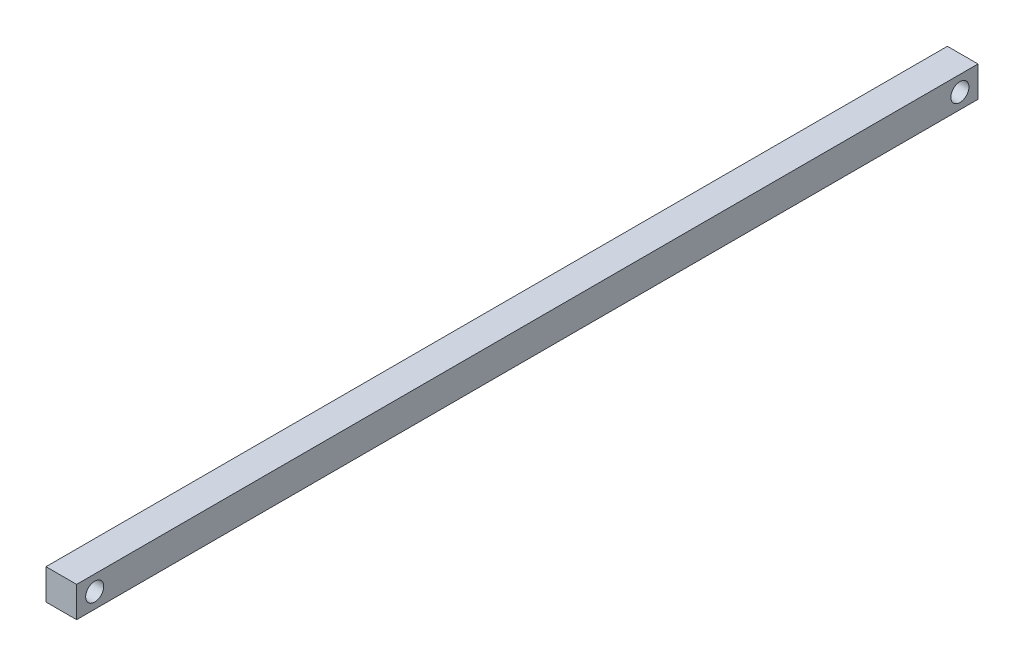
ISO-10303-21;
HEADER;
FILE_DESCRIPTION(('STEP AP214'),'2;1');
FILE_NAME('part.step','',(''),(''),'','','');
FILE_SCHEMA(('AUTOMOTIVE_DESIGN { 1 0 10303 214 1 1 1 1 }'));
ENDSEC;
DATA;
#1=APPLICATION_CONTEXT('core data for automotive mechanical design processes');
#2=APPLICATION_PROTOCOL_DEFINITION('international standard','automotive_design',2000,#1);
#3=PRODUCT_CONTEXT('',#1,'mechanical');
#4=PRODUCT('Part','Part','',(#3));
#5=PRODUCT_RELATED_PRODUCT_CATEGORY('part','',(#4));
#6=PRODUCT_DEFINITION_FORMATION('','',#4);
#7=PRODUCT_DEFINITION_CONTEXT('part definition',#1,'design');
#8=PRODUCT_DEFINITION('design','',#6,#7);
#9=PRODUCT_DEFINITION_SHAPE('','',#8);
#10=(LENGTH_UNIT() NAMED_UNIT(*) SI_UNIT(.MILLI.,.METRE.));
#11=(NAMED_UNIT(*) PLANE_ANGLE_UNIT() SI_UNIT($,.RADIAN.));
#12=(NAMED_UNIT(*) SI_UNIT($,.STERADIAN.) SOLID_ANGLE_UNIT());
#13=UNCERTAINTY_MEASURE_WITH_UNIT(LENGTH_MEASURE(1.E-05),#10,'distance_accuracy_value','');
#14=(GEOMETRIC_REPRESENTATION_CONTEXT(3) GLOBAL_UNCERTAINTY_ASSIGNED_CONTEXT((#13)) GLOBAL_UNIT_ASSIGNED_CONTEXT((#10,
#11,#12)) REPRESENTATION_CONTEXT('',''));
#15=CARTESIAN_POINT('',(0.,0.,0.));
#16=DIRECTION('',(0.,0.,1.));
#17=DIRECTION('',(1.,0.,0.));
#18=AXIS2_PLACEMENT_3D('',#15,#16,#17);
#19=CARTESIAN_POINT('',(12.7,0.,0.));
#20=DIRECTION('',(-1.,0.,0.));
#21=DIRECTION('',(0.,0.,1.));
#22=AXIS2_PLACEMENT_3D('',#19,#20,#21);
#23=PLANE('',#22);
#24=DIRECTION('',(0.,-1.,0.));
#25=VECTOR('',#24,1.);
#26=CARTESIAN_POINT('',(12.7,0.,0.));
#27=LINE('',#26,#25);
#28=CARTESIAN_POINT('',(12.7,12.7,0.));
#29=VERTEX_POINT('',#28);
#30=CARTESIAN_POINT('',(12.7,0.,0.));
#31=VERTEX_POINT('',#30);
#32=EDGE_CURVE('E92',#29,#31,#27,.T.);
#33=ORIENTED_EDGE('',*,*,#32,.T.);
#34=DIRECTION('',(0.,0.,-1.));
#35=VECTOR('',#34,1.);
#36=CARTESIAN_POINT('',(12.7,0.,0.));
#37=LINE('',#36,#35);
#38=CARTESIAN_POINT('',(12.7,0.,-373.8));
#39=VERTEX_POINT('',#38);
#40=EDGE_CURVE('E87',#31,#39,#37,.T.);
#41=ORIENTED_EDGE('',*,*,#40,.T.);
#42=DIRECTION('',(0.,1.,0.));
#43=VECTOR('',#42,1.);
#44=CARTESIAN_POINT('',(12.7,0.,-373.8));
#45=LINE('',#44,#43);
#46=CARTESIAN_POINT('',(12.7,12.7,-373.8));
#47=VERTEX_POINT('',#46);
#48=EDGE_CURVE('E90',#39,#47,#45,.T.);
#49=ORIENTED_EDGE('',*,*,#48,.T.);
#50=DIRECTION('',(0.,0.,1.));
#51=VECTOR('',#50,1.);
#52=CARTESIAN_POINT('',(12.7,12.7,0.));
#53=LINE('',#52,#51);
#54=EDGE_CURVE('E57',#47,#29,#53,.T.);
#55=ORIENTED_EDGE('',*,*,#54,.T.);
#56=EDGE_LOOP('',(#33,#41,#49,#55));
#57=FACE_BOUND('',#56,.T.);
#58=CARTESIAN_POINT('',(12.7,6.35,-7.5));
#59=DIRECTION('',(1.,0.,0.));
#60=DIRECTION('',(0.,0.,-1.));
#61=AXIS2_PLACEMENT_3D('',#58,#59,#60);
#62=CIRCLE('',#61,3.75);
#63=CARTESIAN_POINT('',(12.7,6.35,-11.25));
#64=VERTEX_POINT('',#63);
#65=EDGE_CURVE('E112',#64,#64,#62,.T.);
#66=ORIENTED_EDGE('',*,*,#65,.F.);
#67=EDGE_LOOP('',(#66));
#68=FACE_BOUND('',#67,.T.);
#69=CARTESIAN_POINT('',(12.7,6.35,-366.3));
#70=DIRECTION('',(1.,0.,0.));
#71=DIRECTION('',(0.,0.,-1.));
#72=AXIS2_PLACEMENT_3D('',#69,#70,#71);
#73=CIRCLE('',#72,3.74999999999998);
#74=CARTESIAN_POINT('',(12.7,6.35,-370.05));
#75=VERTEX_POINT('',#74);
#76=EDGE_CURVE('E134',#75,#75,#73,.T.);
#77=ORIENTED_EDGE('',*,*,#76,.F.);
#78=EDGE_LOOP('',(#77));
#79=FACE_BOUND('',#78,.T.);
#80=ADVANCED_FACE('F39',(#57,#68,#79),#23,.F.);
#81=CARTESIAN_POINT('',(0.,0.,0.));
#82=DIRECTION('',(-1.,0.,0.));
#83=DIRECTION('',(0.,0.,1.));
#84=AXIS2_PLACEMENT_3D('',#81,#82,#83);
#85=PLANE('',#84);
#86=CARTESIAN_POINT('',(0.,6.35,-7.5));
#87=DIRECTION('',(1.,0.,0.));
#88=DIRECTION('',(0.,0.,-1.));
#89=AXIS2_PLACEMENT_3D('',#86,#87,#88);
#90=CIRCLE('',#89,3.75);
#91=CARTESIAN_POINT('',(0.,6.35,-11.25));
#92=VERTEX_POINT('',#91);
#93=EDGE_CURVE('E130',#92,#92,#90,.T.);
#94=ORIENTED_EDGE('',*,*,#93,.T.);
#95=EDGE_LOOP('',(#94));
#96=FACE_BOUND('',#95,.T.);
#97=DIRECTION('',(0.,-1.,0.));
#98=VECTOR('',#97,1.);
#99=CARTESIAN_POINT('',(0.,0.,0.));
#100=LINE('',#99,#98);
#101=CARTESIAN_POINT('',(0.,12.7,0.));
#102=VERTEX_POINT('',#101);
#103=CARTESIAN_POINT('',(0.,0.,0.));
#104=VERTEX_POINT('',#103);
#105=EDGE_CURVE('E108',#102,#104,#100,.T.);
#106=ORIENTED_EDGE('',*,*,#105,.F.);
#107=DIRECTION('',(0.,0.,1.));
#108=VECTOR('',#107,1.);
#109=CARTESIAN_POINT('',(0.,12.7,0.));
#110=LINE('',#109,#108);
#111=CARTESIAN_POINT('',(0.,12.7,-373.8));
#112=VERTEX_POINT('',#111);
#113=EDGE_CURVE('E80',#112,#102,#110,.T.);
#114=ORIENTED_EDGE('',*,*,#113,.F.);
#115=DIRECTION('',(0.,1.,0.));
#116=VECTOR('',#115,1.);
#117=CARTESIAN_POINT('',(0.,0.,-373.8));
#118=LINE('',#117,#116);
#119=CARTESIAN_POINT('',(0.,0.,-373.8));
#120=VERTEX_POINT('',#119);
#121=EDGE_CURVE('E74',#120,#112,#118,.T.);
#122=ORIENTED_EDGE('',*,*,#121,.F.);
#123=DIRECTION('',(0.,0.,-1.));
#124=VECTOR('',#123,1.);
#125=CARTESIAN_POINT('',(0.,0.,0.));
#126=LINE('',#125,#124);
#127=EDGE_CURVE('E97',#104,#120,#126,.T.);
#128=ORIENTED_EDGE('',*,*,#127,.F.);
#129=EDGE_LOOP('',(#106,#114,#122,#128));
#130=FACE_BOUND('',#129,.T.);
#131=CARTESIAN_POINT('',(0.,6.35,-366.3));
#132=DIRECTION('',(1.,0.,0.));
#133=DIRECTION('',(0.,0.,-1.));
#134=AXIS2_PLACEMENT_3D('',#131,#132,#133);
#135=CIRCLE('',#134,3.74999999999998);
#136=CARTESIAN_POINT('',(0.,6.35,-370.05));
#137=VERTEX_POINT('',#136);
#138=EDGE_CURVE('E138',#137,#137,#135,.T.);
#139=ORIENTED_EDGE('',*,*,#138,.T.);
#140=EDGE_LOOP('',(#139));
#141=FACE_BOUND('',#140,.T.);
#142=ADVANCED_FACE('F125',(#96,#130,#141),#85,.T.);
#143=CARTESIAN_POINT('',(12.7,0.,0.));
#144=DIRECTION('',(0.,0.,-1.));
#145=DIRECTION('',(-1.,0.,0.));
#146=AXIS2_PLACEMENT_3D('',#143,#144,#145);
#147=PLANE('',#146);
#148=ORIENTED_EDGE('',*,*,#105,.T.);
#149=DIRECTION('',(-1.,0.,0.));
#150=VECTOR('',#149,1.);
#151=CARTESIAN_POINT('',(12.7,0.,0.));
#152=LINE('',#151,#150);
#153=EDGE_CURVE('E11',#31,#104,#152,.T.);
#154=ORIENTED_EDGE('',*,*,#153,.F.);
#155=ORIENTED_EDGE('',*,*,#32,.F.);
#156=DIRECTION('',(-1.,0.,0.));
#157=VECTOR('',#156,1.);
#158=CARTESIAN_POINT('',(12.7,12.7,0.));
#159=LINE('',#158,#157);
#160=EDGE_CURVE('E104',#29,#102,#159,.T.);
#161=ORIENTED_EDGE('',*,*,#160,.T.);
#162=EDGE_LOOP('',(#148,#154,#155,#161));
#163=FACE_BOUND('',#162,.T.);
#164=ADVANCED_FACE('F41',(#163),#147,.F.);
#165=CARTESIAN_POINT('',(12.7,0.,0.));
#166=DIRECTION('',(0.,1.,0.));
#167=DIRECTION('',(0.,0.,1.));
#168=AXIS2_PLACEMENT_3D('',#165,#166,#167);
#169=PLANE('',#168);
#170=ORIENTED_EDGE('',*,*,#127,.T.);
#171=DIRECTION('',(-1.,0.,0.));
#172=VECTOR('',#171,1.);
#173=CARTESIAN_POINT('',(12.7,0.,-373.8));
#174=LINE('',#173,#172);
#175=EDGE_CURVE('E49',#39,#120,#174,.T.);
#176=ORIENTED_EDGE('',*,*,#175,.F.);
#177=ORIENTED_EDGE('',*,*,#40,.F.);
#178=ORIENTED_EDGE('',*,*,#153,.T.);
#179=EDGE_LOOP('',(#170,#176,#177,#178));
#180=FACE_BOUND('',#179,.T.);
#181=ADVANCED_FACE('F96',(#180),#169,.F.);
#182=CARTESIAN_POINT('',(12.7,0.,-373.8));
#183=DIRECTION('',(0.,0.,1.));
#184=DIRECTION('',(1.,0.,0.));
#185=AXIS2_PLACEMENT_3D('',#182,#183,#184);
#186=PLANE('',#185);
#187=ORIENTED_EDGE('',*,*,#121,.T.);
#188=DIRECTION('',(-1.,0.,0.));
#189=VECTOR('',#188,1.);
#190=CARTESIAN_POINT('',(12.7,12.7,-373.8));
#191=LINE('',#190,#189);
#192=EDGE_CURVE('E99',#47,#112,#191,.T.);
#193=ORIENTED_EDGE('',*,*,#192,.F.);
#194=ORIENTED_EDGE('',*,*,#48,.F.);
#195=ORIENTED_EDGE('',*,*,#175,.T.);
#196=EDGE_LOOP('',(#187,#193,#194,#195));
#197=FACE_BOUND('',#196,.T.);
#198=ADVANCED_FACE('F100',(#197),#186,.F.);
#199=CARTESIAN_POINT('',(12.7,12.7,0.));
#200=DIRECTION('',(0.,-1.,0.));
#201=DIRECTION('',(0.,0.,-1.));
#202=AXIS2_PLACEMENT_3D('',#199,#200,#201);
#203=PLANE('',#202);
#204=ORIENTED_EDGE('',*,*,#113,.T.);
#205=ORIENTED_EDGE('',*,*,#160,.F.);
#206=ORIENTED_EDGE('',*,*,#54,.F.);
#207=ORIENTED_EDGE('',*,*,#192,.T.);
#208=EDGE_LOOP('',(#204,#205,#206,#207));
#209=FACE_BOUND('',#208,.T.);
#210=ADVANCED_FACE('F122',(#209),#203,.F.);
#211=CARTESIAN_POINT('',(12.7,6.35,-7.5));
#212=DIRECTION('',(-1.,0.,0.));
#213=DIRECTION('',(0.,0.,1.));
#214=AXIS2_PLACEMENT_3D('',#211,#212,#213);
#215=CYLINDRICAL_SURFACE('',#214,3.75);
#216=ORIENTED_EDGE('',*,*,#65,.T.);
#217=EDGE_LOOP('',(#216));
#218=FACE_BOUND('',#217,.T.);
#219=ORIENTED_EDGE('',*,*,#93,.F.);
#220=EDGE_LOOP('',(#219));
#221=FACE_BOUND('',#220,.T.);
#222=ADVANCED_FACE('F157',(#218,#221),#215,.F.);
#223=CARTESIAN_POINT('',(12.7,6.35,-366.3));
#224=DIRECTION('',(-1.,0.,0.));
#225=DIRECTION('',(0.,0.,1.));
#226=AXIS2_PLACEMENT_3D('',#223,#224,#225);
#227=CYLINDRICAL_SURFACE('',#226,3.74999999999998);
#228=ORIENTED_EDGE('',*,*,#76,.T.);
#229=EDGE_LOOP('',(#228));
#230=FACE_BOUND('',#229,.T.);
#231=ORIENTED_EDGE('',*,*,#138,.F.);
#232=EDGE_LOOP('',(#231));
#233=FACE_BOUND('',#232,.T.);
#234=ADVANCED_FACE('F146',(#230,#233),#227,.F.);
#235=CLOSED_SHELL('',(#80,#142,#164,#181,#198,#210,#222,#234));
#236=MANIFOLD_SOLID_BREP('B2',#235);
#237=ADVANCED_BREP_SHAPE_REPRESENTATION('',(#18,#236),#14);
#238=SHAPE_DEFINITION_REPRESENTATION(#9,#237);
ENDSEC;
END-ISO-10303-21;
